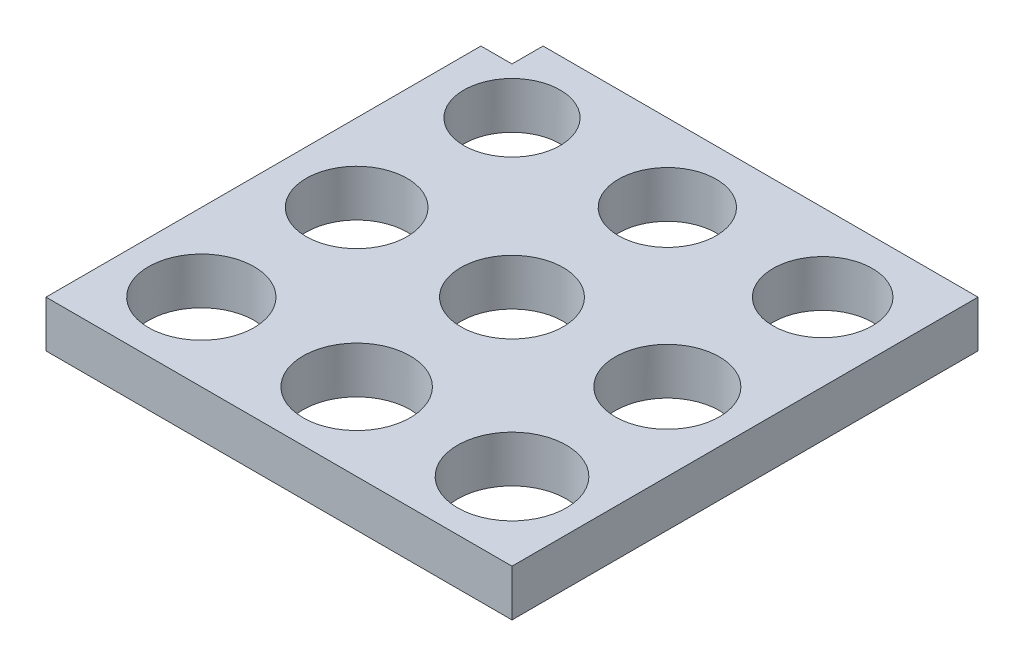
ISO-10303-21;
HEADER;
FILE_DESCRIPTION(('STEP AP214'),'2;1');
FILE_NAME('part.step','',(''),(''),'','','');
FILE_SCHEMA(('AUTOMOTIVE_DESIGN { 1 0 10303 214 1 1 1 1 }'));
ENDSEC;
DATA;
#1=APPLICATION_CONTEXT('core data for automotive mechanical design processes');
#2=APPLICATION_PROTOCOL_DEFINITION('international standard','automotive_design',2000,#1);
#3=PRODUCT_CONTEXT('',#1,'mechanical');
#4=PRODUCT('Part','Part','',(#3));
#5=PRODUCT_RELATED_PRODUCT_CATEGORY('part','',(#4));
#6=PRODUCT_DEFINITION_FORMATION('','',#4);
#7=PRODUCT_DEFINITION_CONTEXT('part definition',#1,'design');
#8=PRODUCT_DEFINITION('design','',#6,#7);
#9=PRODUCT_DEFINITION_SHAPE('','',#8);
#10=(LENGTH_UNIT() NAMED_UNIT(*) SI_UNIT(.MILLI.,.METRE.));
#11=(NAMED_UNIT(*) PLANE_ANGLE_UNIT() SI_UNIT($,.RADIAN.));
#12=(NAMED_UNIT(*) SI_UNIT($,.STERADIAN.) SOLID_ANGLE_UNIT());
#13=UNCERTAINTY_MEASURE_WITH_UNIT(LENGTH_MEASURE(1.E-05),#10,'distance_accuracy_value','');
#14=(GEOMETRIC_REPRESENTATION_CONTEXT(3) GLOBAL_UNCERTAINTY_ASSIGNED_CONTEXT((#13)) GLOBAL_UNIT_ASSIGNED_CONTEXT((#10,
#11,#12)) REPRESENTATION_CONTEXT('',''));
#15=CARTESIAN_POINT('',(0.,0.,0.));
#16=DIRECTION('',(0.,0.,1.));
#17=DIRECTION('',(1.,0.,0.));
#18=AXIS2_PLACEMENT_3D('',#15,#16,#17);
#19=CARTESIAN_POINT('',(7.49999999999999,1.5,7.5));
#20=DIRECTION('',(-1.,0.,0.));
#21=DIRECTION('',(0.,0.,1.));
#22=AXIS2_PLACEMENT_3D('',#19,#20,#21);
#23=PLANE('',#22);
#24=DIRECTION('',(0.,0.,-1.));
#25=VECTOR('',#24,1.);
#26=CARTESIAN_POINT('',(7.49999999999999,0.,7.5));
#27=LINE('',#26,#25);
#28=CARTESIAN_POINT('',(7.49999999999999,0.,7.5));
#29=VERTEX_POINT('',#28);
#30=CARTESIAN_POINT('',(7.49999999999999,0.,-7.5));
#31=VERTEX_POINT('',#30);
#32=EDGE_CURVE('E140',#29,#31,#27,.T.);
#33=ORIENTED_EDGE('',*,*,#32,.T.);
#34=DIRECTION('',(0.,-1.,0.));
#35=VECTOR('',#34,1.);
#36=CARTESIAN_POINT('',(7.49999999999999,1.5,-7.5));
#37=LINE('',#36,#35);
#38=CARTESIAN_POINT('',(7.49999999999999,1.5,-7.5));
#39=VERTEX_POINT('',#38);
#40=EDGE_CURVE('E158',#39,#31,#37,.T.);
#41=ORIENTED_EDGE('',*,*,#40,.F.);
#42=DIRECTION('',(0.,0.,-1.));
#43=VECTOR('',#42,1.);
#44=CARTESIAN_POINT('',(7.49999999999999,1.5,7.5));
#45=LINE('',#44,#43);
#46=CARTESIAN_POINT('',(7.49999999999999,1.5,7.5));
#47=VERTEX_POINT('',#46);
#48=EDGE_CURVE('E136',#47,#39,#45,.T.);
#49=ORIENTED_EDGE('',*,*,#48,.F.);
#50=DIRECTION('',(0.,-1.,0.));
#51=VECTOR('',#50,1.);
#52=CARTESIAN_POINT('',(7.49999999999999,1.5,7.5));
#53=LINE('',#52,#51);
#54=EDGE_CURVE('E133',#47,#29,#53,.T.);
#55=ORIENTED_EDGE('',*,*,#54,.T.);
#56=EDGE_LOOP('',(#33,#41,#49,#55));
#57=FACE_BOUND('',#56,.T.);
#58=ADVANCED_FACE('F47',(#57),#23,.F.);
#59=CARTESIAN_POINT('',(-7.50000000000001,1.5,-7.5));
#60=DIRECTION('',(0.,0.,1.));
#61=DIRECTION('',(1.,0.,0.));
#62=AXIS2_PLACEMENT_3D('',#59,#60,#61);
#63=PLANE('',#62);
#64=DIRECTION('',(-1.,0.,0.));
#65=VECTOR('',#64,1.);
#66=CARTESIAN_POINT('',(-7.50000000000001,0.,-7.5));
#67=LINE('',#66,#65);
#68=CARTESIAN_POINT('',(-6.50000000000001,0.,-7.5));
#69=VERTEX_POINT('',#68);
#70=EDGE_CURVE('E144',#31,#69,#67,.T.);
#71=ORIENTED_EDGE('',*,*,#70,.T.);
#72=DIRECTION('',(0.,1.,0.));
#73=VECTOR('',#72,1.);
#74=CARTESIAN_POINT('',(-6.50000000000001,-8.5,-7.5));
#75=LINE('',#74,#73);
#76=CARTESIAN_POINT('',(-6.50000000000001,1.5,-7.5));
#77=VERTEX_POINT('',#76);
#78=EDGE_CURVE('E222',#69,#77,#75,.T.);
#79=ORIENTED_EDGE('',*,*,#78,.T.);
#80=DIRECTION('',(-1.,0.,0.));
#81=VECTOR('',#80,1.);
#82=CARTESIAN_POINT('',(-7.50000000000001,1.5,-7.5));
#83=LINE('',#82,#81);
#84=EDGE_CURVE('E94',#39,#77,#83,.T.);
#85=ORIENTED_EDGE('',*,*,#84,.F.);
#86=ORIENTED_EDGE('',*,*,#40,.T.);
#87=EDGE_LOOP('',(#71,#79,#85,#86));
#88=FACE_BOUND('',#87,.T.);
#89=ADVANCED_FACE('F275',(#88),#63,.F.);
#90=CARTESIAN_POINT('',(-7.50000000000001,1.5,7.5));
#91=DIRECTION('',(1.,0.,0.));
#92=DIRECTION('',(0.,0.,-1.));
#93=AXIS2_PLACEMENT_3D('',#90,#91,#92);
#94=PLANE('',#93);
#95=DIRECTION('',(0.,0.,1.));
#96=VECTOR('',#95,1.);
#97=CARTESIAN_POINT('',(-7.50000000000001,1.5,7.5));
#98=LINE('',#97,#96);
#99=CARTESIAN_POINT('',(-7.50000000000001,1.5,-6.5));
#100=VERTEX_POINT('',#99);
#101=CARTESIAN_POINT('',(-7.50000000000001,1.5,7.5));
#102=VERTEX_POINT('',#101);
#103=EDGE_CURVE('E121',#100,#102,#98,.T.);
#104=ORIENTED_EDGE('',*,*,#103,.F.);
#105=DIRECTION('',(0.,1.,0.));
#106=VECTOR('',#105,1.);
#107=CARTESIAN_POINT('',(-7.50000000000001,-8.5,-6.5));
#108=LINE('',#107,#106);
#109=CARTESIAN_POINT('',(-7.50000000000001,0.,-6.5));
#110=VERTEX_POINT('',#109);
#111=EDGE_CURVE('E108',#110,#100,#108,.T.);
#112=ORIENTED_EDGE('',*,*,#111,.F.);
#113=DIRECTION('',(0.,0.,1.));
#114=VECTOR('',#113,1.);
#115=CARTESIAN_POINT('',(-7.50000000000001,0.,7.5));
#116=LINE('',#115,#114);
#117=CARTESIAN_POINT('',(-7.50000000000001,0.,7.5));
#118=VERTEX_POINT('',#117);
#119=EDGE_CURVE('E149',#110,#118,#116,.T.);
#120=ORIENTED_EDGE('',*,*,#119,.T.);
#121=DIRECTION('',(0.,-1.,0.));
#122=VECTOR('',#121,1.);
#123=CARTESIAN_POINT('',(-7.50000000000001,1.5,7.5));
#124=LINE('',#123,#122);
#125=EDGE_CURVE('E126',#102,#118,#124,.T.);
#126=ORIENTED_EDGE('',*,*,#125,.F.);
#127=EDGE_LOOP('',(#104,#112,#120,#126));
#128=FACE_BOUND('',#127,.T.);
#129=ADVANCED_FACE('F125',(#128),#94,.F.);
#130=CARTESIAN_POINT('',(-7.50000000000001,1.5,7.5));
#131=DIRECTION('',(0.,0.,-1.));
#132=DIRECTION('',(-1.,0.,0.));
#133=AXIS2_PLACEMENT_3D('',#130,#131,#132);
#134=PLANE('',#133);
#135=DIRECTION('',(1.,0.,0.));
#136=VECTOR('',#135,1.);
#137=CARTESIAN_POINT('',(-7.50000000000001,0.,7.5));
#138=LINE('',#137,#136);
#139=EDGE_CURVE('E87',#118,#29,#138,.T.);
#140=ORIENTED_EDGE('',*,*,#139,.T.);
#141=ORIENTED_EDGE('',*,*,#54,.F.);
#142=DIRECTION('',(1.,0.,0.));
#143=VECTOR('',#142,1.);
#144=CARTESIAN_POINT('',(-7.50000000000001,1.5,7.5));
#145=LINE('',#144,#143);
#146=EDGE_CURVE('E70',#102,#47,#145,.T.);
#147=ORIENTED_EDGE('',*,*,#146,.F.);
#148=ORIENTED_EDGE('',*,*,#125,.T.);
#149=EDGE_LOOP('',(#140,#141,#147,#148));
#150=FACE_BOUND('',#149,.T.);
#151=ADVANCED_FACE('F304',(#150),#134,.F.);
#152=CARTESIAN_POINT('',(0.,1.5,0.));
#153=DIRECTION('',(0.,-1.,0.));
#154=DIRECTION('',(0.,0.,-1.));
#155=AXIS2_PLACEMENT_3D('',#152,#153,#154);
#156=PLANE('',#155);
#157=CARTESIAN_POINT('',(0.,1.5,-5.));
#158=DIRECTION('',(0.,1.,0.));
#159=DIRECTION('',(0.,0.,1.));
#160=AXIS2_PLACEMENT_3D('',#157,#158,#159);
#161=CIRCLE('',#160,1.575);
#162=CARTESIAN_POINT('',(0.,1.5,-3.425));
#163=VERTEX_POINT('',#162);
#164=EDGE_CURVE('E212',#163,#163,#161,.T.);
#165=ORIENTED_EDGE('',*,*,#164,.F.);
#166=EDGE_LOOP('',(#165));
#167=FACE_BOUND('',#166,.T.);
#168=CARTESIAN_POINT('',(4.99999999999998,1.5,-5.));
#169=DIRECTION('',(0.,1.,0.));
#170=DIRECTION('',(0.,0.,1.));
#171=AXIS2_PLACEMENT_3D('',#168,#169,#170);
#172=CIRCLE('',#171,1.6);
#173=CARTESIAN_POINT('',(4.99999999999998,1.5,-3.4));
#174=VERTEX_POINT('',#173);
#175=EDGE_CURVE('E242',#174,#174,#172,.T.);
#176=ORIENTED_EDGE('',*,*,#175,.F.);
#177=EDGE_LOOP('',(#176));
#178=FACE_BOUND('',#177,.T.);
#179=CARTESIAN_POINT('',(-5.,1.5,0.));
#180=DIRECTION('',(0.,1.,0.));
#181=DIRECTION('',(0.,0.,1.));
#182=AXIS2_PLACEMENT_3D('',#179,#180,#181);
#183=CIRCLE('',#182,1.625);
#184=CARTESIAN_POINT('',(-5.,1.5,1.62500000000003));
#185=VERTEX_POINT('',#184);
#186=EDGE_CURVE('E239',#185,#185,#183,.T.);
#187=ORIENTED_EDGE('',*,*,#186,.F.);
#188=EDGE_LOOP('',(#187));
#189=FACE_BOUND('',#188,.T.);
#190=CARTESIAN_POINT('',(0.,1.5,0.));
#191=DIRECTION('',(0.,1.,0.));
#192=DIRECTION('',(0.,0.,1.));
#193=AXIS2_PLACEMENT_3D('',#190,#191,#192);
#194=CIRCLE('',#193,1.65);
#195=CARTESIAN_POINT('',(0.,1.5,1.65));
#196=VERTEX_POINT('',#195);
#197=EDGE_CURVE('E243',#196,#196,#194,.T.);
#198=ORIENTED_EDGE('',*,*,#197,.F.);
#199=EDGE_LOOP('',(#198));
#200=FACE_BOUND('',#199,.T.);
#201=CARTESIAN_POINT('',(5.,1.5,0.));
#202=DIRECTION('',(0.,1.,0.));
#203=DIRECTION('',(0.,0.,1.));
#204=AXIS2_PLACEMENT_3D('',#201,#202,#203);
#205=CIRCLE('',#204,1.675);
#206=CARTESIAN_POINT('',(5.,1.5,1.675));
#207=VERTEX_POINT('',#206);
#208=EDGE_CURVE('E231',#207,#207,#205,.T.);
#209=ORIENTED_EDGE('',*,*,#208,.F.);
#210=EDGE_LOOP('',(#209));
#211=FACE_BOUND('',#210,.T.);
#212=CARTESIAN_POINT('',(5.00000000000005,1.5,5.));
#213=DIRECTION('',(0.,1.,0.));
#214=DIRECTION('',(0.,0.,1.));
#215=AXIS2_PLACEMENT_3D('',#212,#213,#214);
#216=CIRCLE('',#215,1.75);
#217=CARTESIAN_POINT('',(5.00000000000005,1.5,6.75));
#218=VERTEX_POINT('',#217);
#219=EDGE_CURVE('E228',#218,#218,#216,.T.);
#220=ORIENTED_EDGE('',*,*,#219,.F.);
#221=EDGE_LOOP('',(#220));
#222=FACE_BOUND('',#221,.T.);
#223=CARTESIAN_POINT('',(0.,1.5,5.));
#224=DIRECTION('',(0.,1.,0.));
#225=DIRECTION('',(0.,0.,1.));
#226=AXIS2_PLACEMENT_3D('',#223,#224,#225);
#227=CIRCLE('',#226,1.725);
#228=CARTESIAN_POINT('',(0.,1.5,6.725));
#229=VERTEX_POINT('',#228);
#230=EDGE_CURVE('E232',#229,#229,#227,.T.);
#231=ORIENTED_EDGE('',*,*,#230,.F.);
#232=EDGE_LOOP('',(#231));
#233=FACE_BOUND('',#232,.T.);
#234=CARTESIAN_POINT('',(-4.99999999999995,1.5,5.00000000000003));
#235=DIRECTION('',(0.,1.,0.));
#236=DIRECTION('',(0.,0.,1.));
#237=AXIS2_PLACEMENT_3D('',#234,#235,#236);
#238=CIRCLE('',#237,1.7);
#239=CARTESIAN_POINT('',(-4.99999999999995,1.5,6.70000000000003));
#240=VERTEX_POINT('',#239);
#241=EDGE_CURVE('E249',#240,#240,#238,.T.);
#242=ORIENTED_EDGE('',*,*,#241,.F.);
#243=EDGE_LOOP('',(#242));
#244=FACE_BOUND('',#243,.T.);
#245=CARTESIAN_POINT('',(-5.00000000000002,1.5,-4.99999999999997));
#246=DIRECTION('',(0.,1.,0.));
#247=DIRECTION('',(0.,0.,1.));
#248=AXIS2_PLACEMENT_3D('',#245,#246,#247);
#249=CIRCLE('',#248,1.55);
#250=CARTESIAN_POINT('',(-5.00000000000002,1.5,-3.44999999999997));
#251=VERTEX_POINT('',#250);
#252=EDGE_CURVE('E166',#251,#251,#249,.T.);
#253=ORIENTED_EDGE('',*,*,#252,.F.);
#254=EDGE_LOOP('',(#253));
#255=FACE_BOUND('',#254,.T.);
#256=ORIENTED_EDGE('',*,*,#84,.T.);
#257=DIRECTION('',(0.,0.,-1.));
#258=VECTOR('',#257,1.);
#259=CARTESIAN_POINT('',(-6.50000000000001,1.5,-7.5));
#260=LINE('',#259,#258);
#261=CARTESIAN_POINT('',(-6.50000000000001,1.5,-6.5));
#262=VERTEX_POINT('',#261);
#263=EDGE_CURVE('E118',#262,#77,#260,.T.);
#264=ORIENTED_EDGE('',*,*,#263,.F.);
#265=DIRECTION('',(1.,0.,0.));
#266=VECTOR('',#265,1.);
#267=CARTESIAN_POINT('',(-7.50000000000001,1.5,-6.5));
#268=LINE('',#267,#266);
#269=EDGE_CURVE('E111',#100,#262,#268,.T.);
#270=ORIENTED_EDGE('',*,*,#269,.F.);
#271=ORIENTED_EDGE('',*,*,#103,.T.);
#272=ORIENTED_EDGE('',*,*,#146,.T.);
#273=ORIENTED_EDGE('',*,*,#48,.T.);
#274=EDGE_LOOP('',(#256,#264,#270,#271,#272,#273));
#275=FACE_BOUND('',#274,.T.);
#276=ADVANCED_FACE('F120',(#167,#178,#189,#200,#211,#222,#233,#244,#255,#275),#156,.F.);
#277=CARTESIAN_POINT('',(0.,0.,0.));
#278=DIRECTION('',(0.,-1.,0.));
#279=DIRECTION('',(0.,0.,-1.));
#280=AXIS2_PLACEMENT_3D('',#277,#278,#279);
#281=PLANE('',#280);
#282=DIRECTION('',(0.,0.,1.));
#283=VECTOR('',#282,1.);
#284=CARTESIAN_POINT('',(-6.5,0.,0.));
#285=LINE('',#284,#283);
#286=CARTESIAN_POINT('',(-6.50000000000001,0.,-6.5));
#287=VERTEX_POINT('',#286);
#288=EDGE_CURVE('E11',#69,#287,#285,.T.);
#289=ORIENTED_EDGE('',*,*,#288,.F.);
#290=ORIENTED_EDGE('',*,*,#70,.F.);
#291=ORIENTED_EDGE('',*,*,#32,.F.);
#292=ORIENTED_EDGE('',*,*,#139,.F.);
#293=ORIENTED_EDGE('',*,*,#119,.F.);
#294=DIRECTION('',(-1.,0.,0.));
#295=VECTOR('',#294,1.);
#296=CARTESIAN_POINT('',(0.,0.,-6.50000000000001));
#297=LINE('',#296,#295);
#298=EDGE_CURVE('E55',#287,#110,#297,.T.);
#299=ORIENTED_EDGE('',*,*,#298,.F.);
#300=EDGE_LOOP('',(#289,#290,#291,#292,#293,#299));
#301=FACE_BOUND('',#300,.T.);
#302=CARTESIAN_POINT('',(0.,0.,-5.));
#303=DIRECTION('',(0.,-1.,0.));
#304=DIRECTION('',(0.,0.,-1.));
#305=AXIS2_PLACEMENT_3D('',#302,#303,#304);
#306=CIRCLE('',#305,1.575);
#307=CARTESIAN_POINT('',(0.,0.,-6.575));
#308=VERTEX_POINT('',#307);
#309=EDGE_CURVE('E145',#308,#308,#306,.T.);
#310=ORIENTED_EDGE('',*,*,#309,.F.);
#311=EDGE_LOOP('',(#310));
#312=FACE_BOUND('',#311,.T.);
#313=CARTESIAN_POINT('',(4.99999999999998,0.,-5.));
#314=DIRECTION('',(0.,-1.,0.));
#315=DIRECTION('',(0.,0.,-1.));
#316=AXIS2_PLACEMENT_3D('',#313,#314,#315);
#317=CIRCLE('',#316,1.6);
#318=CARTESIAN_POINT('',(4.99999999999998,0.,-6.6));
#319=VERTEX_POINT('',#318);
#320=EDGE_CURVE('E190',#319,#319,#317,.T.);
#321=ORIENTED_EDGE('',*,*,#320,.F.);
#322=EDGE_LOOP('',(#321));
#323=FACE_BOUND('',#322,.T.);
#324=CARTESIAN_POINT('',(-5.,0.,0.));
#325=DIRECTION('',(0.,-1.,0.));
#326=DIRECTION('',(0.,0.,-1.));
#327=AXIS2_PLACEMENT_3D('',#324,#325,#326);
#328=CIRCLE('',#327,1.625);
#329=CARTESIAN_POINT('',(-5.,0.,-1.62499999999996));
#330=VERTEX_POINT('',#329);
#331=EDGE_CURVE('E186',#330,#330,#328,.T.);
#332=ORIENTED_EDGE('',*,*,#331,.F.);
#333=EDGE_LOOP('',(#332));
#334=FACE_BOUND('',#333,.T.);
#335=CARTESIAN_POINT('',(0.,0.,0.));
#336=DIRECTION('',(0.,-1.,0.));
#337=DIRECTION('',(0.,0.,-1.));
#338=AXIS2_PLACEMENT_3D('',#335,#336,#337);
#339=CIRCLE('',#338,1.65);
#340=CARTESIAN_POINT('',(0.,0.,-1.65));
#341=VERTEX_POINT('',#340);
#342=EDGE_CURVE('E182',#341,#341,#339,.T.);
#343=ORIENTED_EDGE('',*,*,#342,.F.);
#344=EDGE_LOOP('',(#343));
#345=FACE_BOUND('',#344,.T.);
#346=CARTESIAN_POINT('',(5.,0.,0.));
#347=DIRECTION('',(0.,-1.,0.));
#348=DIRECTION('',(0.,0.,-1.));
#349=AXIS2_PLACEMENT_3D('',#346,#347,#348);
#350=CIRCLE('',#349,1.675);
#351=CARTESIAN_POINT('',(5.,0.,-1.675));
#352=VERTEX_POINT('',#351);
#353=EDGE_CURVE('E178',#352,#352,#350,.T.);
#354=ORIENTED_EDGE('',*,*,#353,.F.);
#355=EDGE_LOOP('',(#354));
#356=FACE_BOUND('',#355,.T.);
#357=CARTESIAN_POINT('',(5.00000000000005,0.,5.));
#358=DIRECTION('',(0.,-1.,0.));
#359=DIRECTION('',(0.,0.,-1.));
#360=AXIS2_PLACEMENT_3D('',#357,#358,#359);
#361=CIRCLE('',#360,1.75);
#362=CARTESIAN_POINT('',(5.00000000000005,0.,3.25));
#363=VERTEX_POINT('',#362);
#364=EDGE_CURVE('E174',#363,#363,#361,.T.);
#365=ORIENTED_EDGE('',*,*,#364,.F.);
#366=EDGE_LOOP('',(#365));
#367=FACE_BOUND('',#366,.T.);
#368=CARTESIAN_POINT('',(0.,0.,5.));
#369=DIRECTION('',(0.,-1.,0.));
#370=DIRECTION('',(0.,0.,-1.));
#371=AXIS2_PLACEMENT_3D('',#368,#369,#370);
#372=CIRCLE('',#371,1.725);
#373=CARTESIAN_POINT('',(0.,0.,3.275));
#374=VERTEX_POINT('',#373);
#375=EDGE_CURVE('E170',#374,#374,#372,.T.);
#376=ORIENTED_EDGE('',*,*,#375,.F.);
#377=EDGE_LOOP('',(#376));
#378=FACE_BOUND('',#377,.T.);
#379=CARTESIAN_POINT('',(-4.99999999999995,0.,5.00000000000003));
#380=DIRECTION('',(0.,-1.,0.));
#381=DIRECTION('',(0.,0.,-1.));
#382=AXIS2_PLACEMENT_3D('',#379,#380,#381);
#383=CIRCLE('',#382,1.7);
#384=CARTESIAN_POINT('',(-4.99999999999995,0.,3.30000000000003));
#385=VERTEX_POINT('',#384);
#386=EDGE_CURVE('E165',#385,#385,#383,.T.);
#387=ORIENTED_EDGE('',*,*,#386,.F.);
#388=EDGE_LOOP('',(#387));
#389=FACE_BOUND('',#388,.T.);
#390=CARTESIAN_POINT('',(-5.00000000000002,0.,-4.99999999999997));
#391=DIRECTION('',(0.,-1.,0.));
#392=DIRECTION('',(0.,0.,-1.));
#393=AXIS2_PLACEMENT_3D('',#390,#391,#392);
#394=CIRCLE('',#393,1.55);
#395=CARTESIAN_POINT('',(-5.00000000000002,0.,-6.54999999999997));
#396=VERTEX_POINT('',#395);
#397=EDGE_CURVE('E161',#396,#396,#394,.T.);
#398=ORIENTED_EDGE('',*,*,#397,.F.);
#399=EDGE_LOOP('',(#398));
#400=FACE_BOUND('',#399,.T.);
#401=ADVANCED_FACE('F283',(#301,#312,#323,#334,#345,#356,#367,#378,#389,#400),#281,.T.);
#402=CARTESIAN_POINT('',(-5.00000000000002,-8.5,-4.99999999999997));
#403=DIRECTION('',(0.,1.,0.));
#404=DIRECTION('',(0.,0.,1.));
#405=AXIS2_PLACEMENT_3D('',#402,#403,#404);
#406=CYLINDRICAL_SURFACE('',#405,1.55);
#407=ORIENTED_EDGE('',*,*,#397,.T.);
#408=EDGE_LOOP('',(#407));
#409=FACE_BOUND('',#408,.T.);
#410=ORIENTED_EDGE('',*,*,#252,.T.);
#411=EDGE_LOOP('',(#410));
#412=FACE_BOUND('',#411,.T.);
#413=ADVANCED_FACE('F311',(#409,#412),#406,.F.);
#414=CARTESIAN_POINT('',(-4.99999999999995,-8.5,5.00000000000003));
#415=DIRECTION('',(0.,1.,0.));
#416=DIRECTION('',(0.,0.,1.));
#417=AXIS2_PLACEMENT_3D('',#414,#415,#416);
#418=CYLINDRICAL_SURFACE('',#417,1.7);
#419=ORIENTED_EDGE('',*,*,#386,.T.);
#420=EDGE_LOOP('',(#419));
#421=FACE_BOUND('',#420,.T.);
#422=ORIENTED_EDGE('',*,*,#241,.T.);
#423=EDGE_LOOP('',(#422));
#424=FACE_BOUND('',#423,.T.);
#425=ADVANCED_FACE('F317',(#421,#424),#418,.F.);
#426=CARTESIAN_POINT('',(0.,-8.5,5.));
#427=DIRECTION('',(0.,1.,0.));
#428=DIRECTION('',(0.,0.,1.));
#429=AXIS2_PLACEMENT_3D('',#426,#427,#428);
#430=CYLINDRICAL_SURFACE('',#429,1.725);
#431=ORIENTED_EDGE('',*,*,#375,.T.);
#432=EDGE_LOOP('',(#431));
#433=FACE_BOUND('',#432,.T.);
#434=ORIENTED_EDGE('',*,*,#230,.T.);
#435=EDGE_LOOP('',(#434));
#436=FACE_BOUND('',#435,.T.);
#437=ADVANCED_FACE('F333',(#433,#436),#430,.F.);
#438=CARTESIAN_POINT('',(5.00000000000005,-8.5,5.));
#439=DIRECTION('',(0.,1.,0.));
#440=DIRECTION('',(0.,0.,1.));
#441=AXIS2_PLACEMENT_3D('',#438,#439,#440);
#442=CYLINDRICAL_SURFACE('',#441,1.75);
#443=ORIENTED_EDGE('',*,*,#364,.T.);
#444=EDGE_LOOP('',(#443));
#445=FACE_BOUND('',#444,.T.);
#446=ORIENTED_EDGE('',*,*,#219,.T.);
#447=EDGE_LOOP('',(#446));
#448=FACE_BOUND('',#447,.T.);
#449=ADVANCED_FACE('F337',(#445,#448),#442,.F.);
#450=CARTESIAN_POINT('',(5.,-8.5,0.));
#451=DIRECTION('',(0.,1.,0.));
#452=DIRECTION('',(0.,0.,1.));
#453=AXIS2_PLACEMENT_3D('',#450,#451,#452);
#454=CYLINDRICAL_SURFACE('',#453,1.675);
#455=ORIENTED_EDGE('',*,*,#353,.T.);
#456=EDGE_LOOP('',(#455));
#457=FACE_BOUND('',#456,.T.);
#458=ORIENTED_EDGE('',*,*,#208,.T.);
#459=EDGE_LOOP('',(#458));
#460=FACE_BOUND('',#459,.T.);
#461=ADVANCED_FACE('F323',(#457,#460),#454,.F.);
#462=CARTESIAN_POINT('',(0.,-8.5,0.));
#463=DIRECTION('',(0.,1.,0.));
#464=DIRECTION('',(0.,0.,1.));
#465=AXIS2_PLACEMENT_3D('',#462,#463,#464);
#466=CYLINDRICAL_SURFACE('',#465,1.65);
#467=ORIENTED_EDGE('',*,*,#342,.T.);
#468=EDGE_LOOP('',(#467));
#469=FACE_BOUND('',#468,.T.);
#470=ORIENTED_EDGE('',*,*,#197,.T.);
#471=EDGE_LOOP('',(#470));
#472=FACE_BOUND('',#471,.T.);
#473=ADVANCED_FACE('F319',(#469,#472),#466,.F.);
#474=CARTESIAN_POINT('',(-5.,-8.5,0.));
#475=DIRECTION('',(0.,1.,0.));
#476=DIRECTION('',(0.,0.,1.));
#477=AXIS2_PLACEMENT_3D('',#474,#475,#476);
#478=CYLINDRICAL_SURFACE('',#477,1.625);
#479=ORIENTED_EDGE('',*,*,#331,.T.);
#480=EDGE_LOOP('',(#479));
#481=FACE_BOUND('',#480,.T.);
#482=ORIENTED_EDGE('',*,*,#186,.T.);
#483=EDGE_LOOP('',(#482));
#484=FACE_BOUND('',#483,.T.);
#485=ADVANCED_FACE('F322',(#481,#484),#478,.F.);
#486=CARTESIAN_POINT('',(4.99999999999998,-8.5,-5.));
#487=DIRECTION('',(0.,1.,0.));
#488=DIRECTION('',(0.,0.,1.));
#489=AXIS2_PLACEMENT_3D('',#486,#487,#488);
#490=CYLINDRICAL_SURFACE('',#489,1.6);
#491=ORIENTED_EDGE('',*,*,#320,.T.);
#492=EDGE_LOOP('',(#491));
#493=FACE_BOUND('',#492,.T.);
#494=ORIENTED_EDGE('',*,*,#175,.T.);
#495=EDGE_LOOP('',(#494));
#496=FACE_BOUND('',#495,.T.);
#497=ADVANCED_FACE('F294',(#493,#496),#490,.F.);
#498=CARTESIAN_POINT('',(0.,-8.5,-5.));
#499=DIRECTION('',(0.,1.,0.));
#500=DIRECTION('',(0.,0.,1.));
#501=AXIS2_PLACEMENT_3D('',#498,#499,#500);
#502=CYLINDRICAL_SURFACE('',#501,1.575);
#503=ORIENTED_EDGE('',*,*,#309,.T.);
#504=EDGE_LOOP('',(#503));
#505=FACE_BOUND('',#504,.T.);
#506=ORIENTED_EDGE('',*,*,#164,.T.);
#507=EDGE_LOOP('',(#506));
#508=FACE_BOUND('',#507,.T.);
#509=ADVANCED_FACE('F287',(#505,#508),#502,.F.);
#510=CARTESIAN_POINT('',(-6.50000000000001,-8.5,-7.5));
#511=DIRECTION('',(1.,0.,0.));
#512=DIRECTION('',(0.,0.,-1.));
#513=AXIS2_PLACEMENT_3D('',#510,#511,#512);
#514=PLANE('',#513);
#515=ORIENTED_EDGE('',*,*,#288,.T.);
#516=DIRECTION('',(0.,1.,0.));
#517=VECTOR('',#516,1.);
#518=CARTESIAN_POINT('',(-6.50000000000001,-8.5,-6.5));
#519=LINE('',#518,#517);
#520=EDGE_CURVE('E62',#287,#262,#519,.T.);
#521=ORIENTED_EDGE('',*,*,#520,.T.);
#522=ORIENTED_EDGE('',*,*,#263,.T.);
#523=ORIENTED_EDGE('',*,*,#78,.F.);
#524=EDGE_LOOP('',(#515,#521,#522,#523));
#525=FACE_BOUND('',#524,.T.);
#526=ADVANCED_FACE('F285',(#525),#514,.F.);
#527=CARTESIAN_POINT('',(-7.50000000000001,-8.5,-6.5));
#528=DIRECTION('',(0.,0.,1.));
#529=DIRECTION('',(1.,0.,0.));
#530=AXIS2_PLACEMENT_3D('',#527,#528,#529);
#531=PLANE('',#530);
#532=ORIENTED_EDGE('',*,*,#298,.T.);
#533=ORIENTED_EDGE('',*,*,#111,.T.);
#534=ORIENTED_EDGE('',*,*,#269,.T.);
#535=ORIENTED_EDGE('',*,*,#520,.F.);
#536=EDGE_LOOP('',(#532,#533,#534,#535));
#537=FACE_BOUND('',#536,.T.);
#538=ADVANCED_FACE('F110',(#537),#531,.F.);
#539=CLOSED_SHELL('',(#58,#89,#129,#151,#276,#401,#413,#425,#437,#449,#461,#473,#485,#497,#509,
#526,#538));
#540=MANIFOLD_SOLID_BREP('B2',#539);
#541=ADVANCED_BREP_SHAPE_REPRESENTATION('',(#18,#540),#14);
#542=SHAPE_DEFINITION_REPRESENTATION(#9,#541);
ENDSEC;
END-ISO-10303-21;
